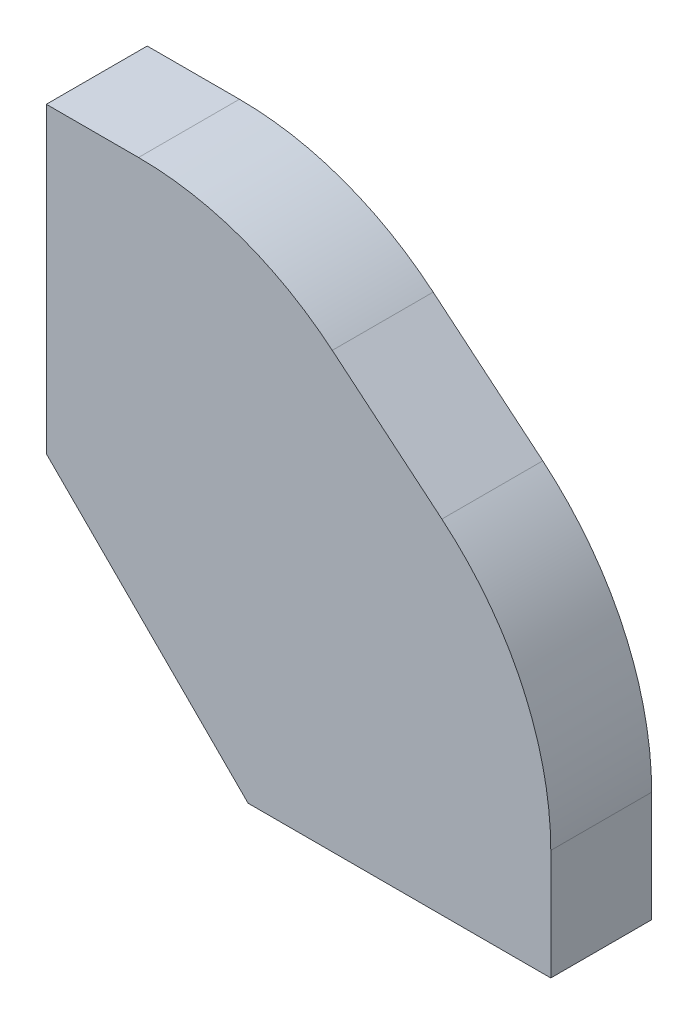
ISO-10303-21;
HEADER;
FILE_DESCRIPTION(('STEP AP214'),'2;1');
FILE_NAME('part.step','',(''),(''),'','','');
FILE_SCHEMA(('AUTOMOTIVE_DESIGN { 1 0 10303 214 1 1 1 1 }'));
ENDSEC;
DATA;
#1=APPLICATION_CONTEXT('core data for automotive mechanical design processes');
#2=APPLICATION_PROTOCOL_DEFINITION('international standard','automotive_design',2000,#1);
#3=PRODUCT_CONTEXT('',#1,'mechanical');
#4=PRODUCT('Part','Part','',(#3));
#5=PRODUCT_RELATED_PRODUCT_CATEGORY('part','',(#4));
#6=PRODUCT_DEFINITION_FORMATION('','',#4);
#7=PRODUCT_DEFINITION_CONTEXT('part definition',#1,'design');
#8=PRODUCT_DEFINITION('design','',#6,#7);
#9=PRODUCT_DEFINITION_SHAPE('','',#8);
#10=(LENGTH_UNIT() NAMED_UNIT(*) SI_UNIT(.MILLI.,.METRE.));
#11=(NAMED_UNIT(*) PLANE_ANGLE_UNIT() SI_UNIT($,.RADIAN.));
#12=(NAMED_UNIT(*) SI_UNIT($,.STERADIAN.) SOLID_ANGLE_UNIT());
#13=UNCERTAINTY_MEASURE_WITH_UNIT(LENGTH_MEASURE(1.E-05),#10,'distance_accuracy_value','');
#14=(GEOMETRIC_REPRESENTATION_CONTEXT(3) GLOBAL_UNCERTAINTY_ASSIGNED_CONTEXT((#13)) GLOBAL_UNIT_ASSIGNED_CONTEXT((#10,
#11,#12)) REPRESENTATION_CONTEXT('',''));
#15=CARTESIAN_POINT('',(0.,0.,0.));
#16=DIRECTION('',(0.,0.,1.));
#17=DIRECTION('',(1.,0.,0.));
#18=AXIS2_PLACEMENT_3D('',#15,#16,#17);
#19=CARTESIAN_POINT('',(29.9999999999999,25.,10.));
#20=DIRECTION('',(-1.,0.,0.));
#21=DIRECTION('',(0.,0.,1.));
#22=AXIS2_PLACEMENT_3D('',#19,#20,#21);
#23=PLANE('',#22);
#24=DIRECTION('',(0.,1.,0.));
#25=VECTOR('',#24,1.);
#26=CARTESIAN_POINT('',(29.9999999999999,25.,0.));
#27=LINE('',#26,#25);
#28=CARTESIAN_POINT('',(29.9999999999999,0.,0.));
#29=VERTEX_POINT('',#28);
#30=CARTESIAN_POINT('',(29.9999999999999,10.9487516204667,0.));
#31=VERTEX_POINT('',#30);
#32=EDGE_CURVE('E132',#29,#31,#27,.T.);
#33=ORIENTED_EDGE('',*,*,#32,.T.);
#34=DIRECTION('',(0.,0.,-1.));
#35=VECTOR('',#34,1.);
#36=CARTESIAN_POINT('',(29.9999999999999,10.9487516204667,10.));
#37=LINE('',#36,#35);
#38=CARTESIAN_POINT('',(29.9999999999999,10.9487516204667,10.));
#39=VERTEX_POINT('',#38);
#40=EDGE_CURVE('E11',#31,#39,#37,.F.);
#41=ORIENTED_EDGE('',*,*,#40,.T.);
#42=DIRECTION('',(0.,1.,0.));
#43=VECTOR('',#42,1.);
#44=CARTESIAN_POINT('',(29.9999999999999,25.,10.));
#45=LINE('',#44,#43);
#46=CARTESIAN_POINT('',(29.9999999999999,0.,10.));
#47=VERTEX_POINT('',#46);
#48=EDGE_CURVE('E143',#47,#39,#45,.T.);
#49=ORIENTED_EDGE('',*,*,#48,.F.);
#50=DIRECTION('',(0.,0.,-1.));
#51=VECTOR('',#50,1.);
#52=CARTESIAN_POINT('',(29.9999999999999,0.,10.));
#53=LINE('',#52,#51);
#54=EDGE_CURVE('E131',#47,#29,#53,.T.);
#55=ORIENTED_EDGE('',*,*,#54,.T.);
#56=EDGE_LOOP('',(#33,#41,#49,#55));
#57=FACE_BOUND('',#56,.T.);
#58=ADVANCED_FACE('F33',(#57),#23,.F.);
#59=CARTESIAN_POINT('',(0.,50.,10.));
#60=DIRECTION('',(-0.64018439966448,-0.768221279597376,0.));
#61=DIRECTION('',(0.768221279597376,-0.64018439966448,0.));
#62=AXIS2_PLACEMENT_3D('',#59,#60,#61);
#63=PLANE('',#62);
#64=DIRECTION('',(-0.768221279597376,0.64018439966448,0.));
#65=VECTOR('',#64,1.);
#66=CARTESIAN_POINT('',(0.,50.,0.));
#67=LINE('',#66,#65);
#68=CARTESIAN_POINT('',(19.2055319899343,33.995390008388,0.));
#69=VERTEX_POINT('',#68);
#70=CARTESIAN_POINT('',(8.34403393449439,43.0466383879213,0.));
#71=VERTEX_POINT('',#70);
#72=EDGE_CURVE('E134',#69,#71,#67,.T.);
#73=ORIENTED_EDGE('',*,*,#72,.T.);
#74=DIRECTION('',(0.,0.,-1.));
#75=VECTOR('',#74,1.);
#76=CARTESIAN_POINT('',(8.34403393449439,43.0466383879213,10.));
#77=LINE('',#76,#75);
#78=CARTESIAN_POINT('',(8.34403393449439,43.0466383879213,10.));
#79=VERTEX_POINT('',#78);
#80=EDGE_CURVE('E54',#71,#79,#77,.F.);
#81=ORIENTED_EDGE('',*,*,#80,.T.);
#82=DIRECTION('',(-0.768221279597376,0.64018439966448,0.));
#83=VECTOR('',#82,1.);
#84=CARTESIAN_POINT('',(0.,50.,10.));
#85=LINE('',#84,#83);
#86=CARTESIAN_POINT('',(19.2055319899343,33.995390008388,10.));
#87=VERTEX_POINT('',#86);
#88=EDGE_CURVE('E109',#87,#79,#85,.T.);
#89=ORIENTED_EDGE('',*,*,#88,.F.);
#90=DIRECTION('',(0.,0.,-1.));
#91=VECTOR('',#90,1.);
#92=CARTESIAN_POINT('',(19.2055319899343,33.995390008388,10.));
#93=LINE('',#92,#91);
#94=EDGE_CURVE('E155',#87,#69,#93,.T.);
#95=ORIENTED_EDGE('',*,*,#94,.T.);
#96=EDGE_LOOP('',(#73,#81,#89,#95));
#97=FACE_BOUND('',#96,.T.);
#98=ADVANCED_FACE('F163',(#97),#63,.F.);
#99=CARTESIAN_POINT('',(-20.0000000000001,50.,10.));
#100=DIRECTION('',(0.,-1.,0.));
#101=DIRECTION('',(0.,0.,-1.));
#102=AXIS2_PLACEMENT_3D('',#99,#100,#101);
#103=PLANE('',#102);
#104=DIRECTION('',(-1.,0.,0.));
#105=VECTOR('',#104,1.);
#106=CARTESIAN_POINT('',(-20.0000000000001,50.,10.));
#107=LINE('',#106,#105);
#108=CARTESIAN_POINT('',(-10.86149805544,50.,10.));
#109=VERTEX_POINT('',#108);
#110=CARTESIAN_POINT('',(-20.0000000000001,50.,10.));
#111=VERTEX_POINT('',#110);
#112=EDGE_CURVE('E99',#109,#111,#107,.T.);
#113=ORIENTED_EDGE('',*,*,#112,.F.);
#114=DIRECTION('',(0.,0.,-1.));
#115=VECTOR('',#114,1.);
#116=CARTESIAN_POINT('',(-10.86149805544,50.,10.));
#117=LINE('',#116,#115);
#118=CARTESIAN_POINT('',(-10.86149805544,50.,0.));
#119=VERTEX_POINT('',#118);
#120=EDGE_CURVE('E118',#109,#119,#117,.T.);
#121=ORIENTED_EDGE('',*,*,#120,.T.);
#122=DIRECTION('',(-1.,0.,0.));
#123=VECTOR('',#122,1.);
#124=CARTESIAN_POINT('',(-20.0000000000001,50.,0.));
#125=LINE('',#124,#123);
#126=CARTESIAN_POINT('',(-20.0000000000001,50.,0.));
#127=VERTEX_POINT('',#126);
#128=EDGE_CURVE('E115',#119,#127,#125,.T.);
#129=ORIENTED_EDGE('',*,*,#128,.T.);
#130=DIRECTION('',(0.,0.,-1.));
#131=VECTOR('',#130,1.);
#132=CARTESIAN_POINT('',(-20.0000000000001,50.,10.));
#133=LINE('',#132,#131);
#134=EDGE_CURVE('E112',#111,#127,#133,.T.);
#135=ORIENTED_EDGE('',*,*,#134,.F.);
#136=EDGE_LOOP('',(#113,#121,#129,#135));
#137=FACE_BOUND('',#136,.T.);
#138=ADVANCED_FACE('F113',(#137),#103,.F.);
#139=CARTESIAN_POINT('',(-20.0000000000001,20.,10.));
#140=DIRECTION('',(1.,0.,0.));
#141=DIRECTION('',(0.,0.,-1.));
#142=AXIS2_PLACEMENT_3D('',#139,#140,#141);
#143=PLANE('',#142);
#144=DIRECTION('',(0.,-1.,0.));
#145=VECTOR('',#144,1.);
#146=CARTESIAN_POINT('',(-20.0000000000001,20.,0.));
#147=LINE('',#146,#145);
#148=CARTESIAN_POINT('',(-20.0000000000001,20.,0.));
#149=VERTEX_POINT('',#148);
#150=EDGE_CURVE('E137',#127,#149,#147,.T.);
#151=ORIENTED_EDGE('',*,*,#150,.T.);
#152=DIRECTION('',(0.,0.,-1.));
#153=VECTOR('',#152,1.);
#154=CARTESIAN_POINT('',(-20.0000000000001,20.,10.));
#155=LINE('',#154,#153);
#156=CARTESIAN_POINT('',(-20.0000000000001,20.,10.));
#157=VERTEX_POINT('',#156);
#158=EDGE_CURVE('E119',#157,#149,#155,.T.);
#159=ORIENTED_EDGE('',*,*,#158,.F.);
#160=DIRECTION('',(0.,-1.,0.));
#161=VECTOR('',#160,1.);
#162=CARTESIAN_POINT('',(-20.0000000000001,20.,10.));
#163=LINE('',#162,#161);
#164=EDGE_CURVE('E103',#111,#157,#163,.T.);
#165=ORIENTED_EDGE('',*,*,#164,.F.);
#166=ORIENTED_EDGE('',*,*,#134,.T.);
#167=EDGE_LOOP('',(#151,#159,#165,#166));
#168=FACE_BOUND('',#167,.T.);
#169=ADVANCED_FACE('F121',(#168),#143,.F.);
#170=CARTESIAN_POINT('',(-20.0000000000001,20.,10.));
#171=DIRECTION('',(0.707106781186546,0.707106781186549,0.));
#172=DIRECTION('',(-0.707106781186549,0.707106781186546,0.));
#173=AXIS2_PLACEMENT_3D('',#170,#171,#172);
#174=PLANE('',#173);
#175=DIRECTION('',(0.707106781186549,-0.707106781186546,0.));
#176=VECTOR('',#175,1.);
#177=CARTESIAN_POINT('',(-20.0000000000001,20.,0.));
#178=LINE('',#177,#176);
#179=CARTESIAN_POINT('',(0.,0.,0.));
#180=VERTEX_POINT('',#179);
#181=EDGE_CURVE('E139',#149,#180,#178,.T.);
#182=ORIENTED_EDGE('',*,*,#181,.T.);
#183=DIRECTION('',(0.,0.,-1.));
#184=VECTOR('',#183,1.);
#185=CARTESIAN_POINT('',(0.,0.,10.));
#186=LINE('',#185,#184);
#187=CARTESIAN_POINT('',(0.,0.,10.));
#188=VERTEX_POINT('',#187);
#189=EDGE_CURVE('E146',#188,#180,#186,.T.);
#190=ORIENTED_EDGE('',*,*,#189,.F.);
#191=DIRECTION('',(0.707106781186549,-0.707106781186546,0.));
#192=VECTOR('',#191,1.);
#193=CARTESIAN_POINT('',(-20.0000000000001,20.,10.));
#194=LINE('',#193,#192);
#195=EDGE_CURVE('E124',#157,#188,#194,.T.);
#196=ORIENTED_EDGE('',*,*,#195,.F.);
#197=ORIENTED_EDGE('',*,*,#158,.T.);
#198=EDGE_LOOP('',(#182,#190,#196,#197));
#199=FACE_BOUND('',#198,.T.);
#200=ADVANCED_FACE('F176',(#199),#174,.F.);
#201=CARTESIAN_POINT('',(0.,0.,10.));
#202=DIRECTION('',(0.,1.,0.));
#203=DIRECTION('',(0.,0.,1.));
#204=AXIS2_PLACEMENT_3D('',#201,#202,#203);
#205=PLANE('',#204);
#206=DIRECTION('',(1.,0.,0.));
#207=VECTOR('',#206,1.);
#208=CARTESIAN_POINT('',(0.,0.,0.));
#209=LINE('',#208,#207);
#210=EDGE_CURVE('E141',#180,#29,#209,.T.);
#211=ORIENTED_EDGE('',*,*,#210,.T.);
#212=ORIENTED_EDGE('',*,*,#54,.F.);
#213=DIRECTION('',(1.,0.,0.));
#214=VECTOR('',#213,1.);
#215=CARTESIAN_POINT('',(0.,0.,10.));
#216=LINE('',#215,#214);
#217=EDGE_CURVE('E126',#188,#47,#216,.T.);
#218=ORIENTED_EDGE('',*,*,#217,.F.);
#219=ORIENTED_EDGE('',*,*,#189,.T.);
#220=EDGE_LOOP('',(#211,#212,#218,#219));
#221=FACE_BOUND('',#220,.T.);
#222=ADVANCED_FACE('F172',(#221),#205,.F.);
#223=CARTESIAN_POINT('',(0.,0.,10.));
#224=DIRECTION('',(0.,0.,1.));
#225=DIRECTION('',(1.,0.,0.));
#226=AXIS2_PLACEMENT_3D('',#223,#224,#225);
#227=PLANE('',#226);
#228=ORIENTED_EDGE('',*,*,#88,.T.);
#229=CARTESIAN_POINT('',(-10.86149805544,20.,10.));
#230=DIRECTION('',(0.,0.,1.));
#231=DIRECTION('',(1.,0.,0.));
#232=AXIS2_PLACEMENT_3D('',#229,#230,#231);
#233=CIRCLE('',#232,30.);
#234=EDGE_CURVE('E41',#79,#109,#233,.T.);
#235=ORIENTED_EDGE('',*,*,#234,.T.);
#236=ORIENTED_EDGE('',*,*,#112,.T.);
#237=ORIENTED_EDGE('',*,*,#164,.T.);
#238=ORIENTED_EDGE('',*,*,#195,.T.);
#239=ORIENTED_EDGE('',*,*,#217,.T.);
#240=ORIENTED_EDGE('',*,*,#48,.T.);
#241=CARTESIAN_POINT('',(0.,10.9487516204667,10.));
#242=DIRECTION('',(0.,0.,1.));
#243=DIRECTION('',(1.,0.,0.));
#244=AXIS2_PLACEMENT_3D('',#241,#242,#243);
#245=CIRCLE('',#244,30.);
#246=EDGE_CURVE('E159',#39,#87,#245,.T.);
#247=ORIENTED_EDGE('',*,*,#246,.T.);
#248=EDGE_LOOP('',(#228,#235,#236,#237,#238,#239,#240,#247));
#249=FACE_BOUND('',#248,.T.);
#250=ADVANCED_FACE('F101',(#249),#227,.T.);
#251=CARTESIAN_POINT('',(0.,0.,0.));
#252=DIRECTION('',(0.,0.,1.));
#253=DIRECTION('',(1.,0.,0.));
#254=AXIS2_PLACEMENT_3D('',#251,#252,#253);
#255=PLANE('',#254);
#256=ORIENTED_EDGE('',*,*,#128,.F.);
#257=CARTESIAN_POINT('',(-10.86149805544,20.,0.));
#258=DIRECTION('',(0.,0.,1.));
#259=DIRECTION('',(1.,0.,0.));
#260=AXIS2_PLACEMENT_3D('',#257,#258,#259);
#261=CIRCLE('',#260,30.);
#262=EDGE_CURVE('E153',#119,#71,#261,.F.);
#263=ORIENTED_EDGE('',*,*,#262,.T.);
#264=ORIENTED_EDGE('',*,*,#72,.F.);
#265=CARTESIAN_POINT('',(0.,10.9487516204667,0.));
#266=DIRECTION('',(0.,0.,1.));
#267=DIRECTION('',(1.,0.,0.));
#268=AXIS2_PLACEMENT_3D('',#265,#266,#267);
#269=CIRCLE('',#268,30.);
#270=EDGE_CURVE('E151',#69,#31,#269,.F.);
#271=ORIENTED_EDGE('',*,*,#270,.T.);
#272=ORIENTED_EDGE('',*,*,#32,.F.);
#273=ORIENTED_EDGE('',*,*,#210,.F.);
#274=ORIENTED_EDGE('',*,*,#181,.F.);
#275=ORIENTED_EDGE('',*,*,#150,.F.);
#276=EDGE_LOOP('',(#256,#263,#264,#271,#272,#273,#274,#275));
#277=FACE_BOUND('',#276,.T.);
#278=ADVANCED_FACE('F167',(#277),#255,.F.);
#279=CARTESIAN_POINT('',(-10.86149805544,20.,10.));
#280=DIRECTION('',(0.,0.,-1.));
#281=DIRECTION('',(-1.,0.,0.));
#282=AXIS2_PLACEMENT_3D('',#279,#280,#281);
#283=CYLINDRICAL_SURFACE('',#282,30.);
#284=ORIENTED_EDGE('',*,*,#234,.F.);
#285=ORIENTED_EDGE('',*,*,#80,.F.);
#286=ORIENTED_EDGE('',*,*,#262,.F.);
#287=ORIENTED_EDGE('',*,*,#120,.F.);
#288=EDGE_LOOP('',(#284,#285,#286,#287));
#289=FACE_BOUND('',#288,.T.);
#290=ADVANCED_FACE('F192',(#289),#283,.T.);
#291=CARTESIAN_POINT('',(0.,10.9487516204667,10.));
#292=DIRECTION('',(0.,0.,-1.));
#293=DIRECTION('',(-1.,0.,0.));
#294=AXIS2_PLACEMENT_3D('',#291,#292,#293);
#295=CYLINDRICAL_SURFACE('',#294,30.);
#296=ORIENTED_EDGE('',*,*,#246,.F.);
#297=ORIENTED_EDGE('',*,*,#40,.F.);
#298=ORIENTED_EDGE('',*,*,#270,.F.);
#299=ORIENTED_EDGE('',*,*,#94,.F.);
#300=EDGE_LOOP('',(#296,#297,#298,#299));
#301=FACE_BOUND('',#300,.T.);
#302=ADVANCED_FACE('F35',(#301),#295,.T.);
#303=CLOSED_SHELL('',(#58,#98,#138,#169,#200,#222,#250,#278,#290,#302));
#304=MANIFOLD_SOLID_BREP('B2',#303);
#305=ADVANCED_BREP_SHAPE_REPRESENTATION('',(#18,#304),#14);
#306=SHAPE_DEFINITION_REPRESENTATION(#9,#305);
ENDSEC;
END-ISO-10303-21;
